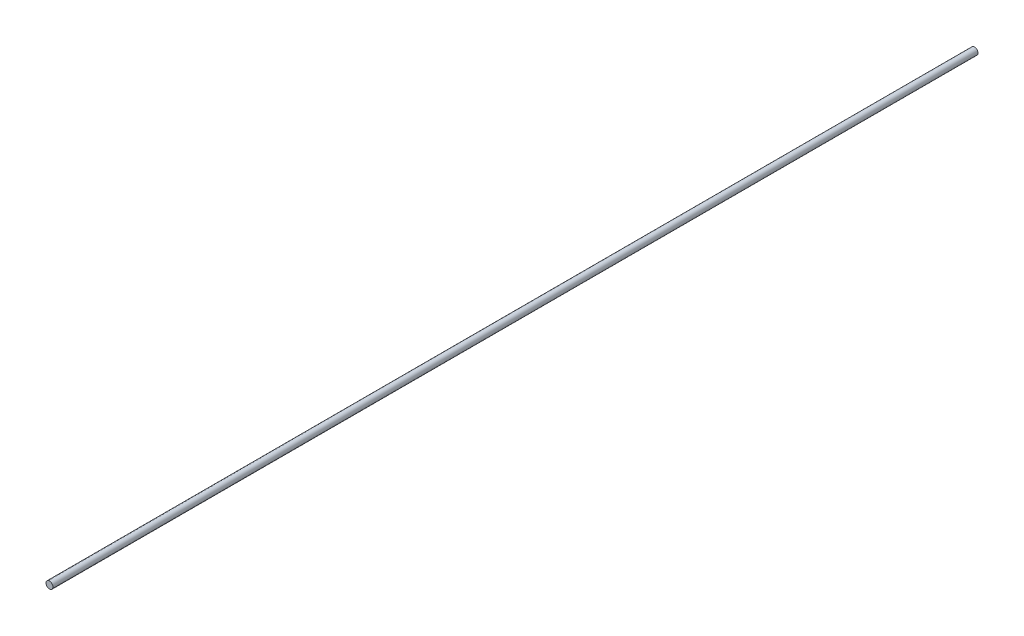
ISO-10303-21;
HEADER;
FILE_DESCRIPTION(('STEP AP214'),'2;1');
FILE_NAME('part.step','',(''),(''),'','','');
FILE_SCHEMA(('AUTOMOTIVE_DESIGN { 1 0 10303 214 1 1 1 1 }'));
ENDSEC;
DATA;
#1=APPLICATION_CONTEXT('core data for automotive mechanical design processes');
#2=APPLICATION_PROTOCOL_DEFINITION('international standard','automotive_design',2000,#1);
#3=PRODUCT_CONTEXT('',#1,'mechanical');
#4=PRODUCT('Part','Part','',(#3));
#5=PRODUCT_RELATED_PRODUCT_CATEGORY('part','',(#4));
#6=PRODUCT_DEFINITION_FORMATION('','',#4);
#7=PRODUCT_DEFINITION_CONTEXT('part definition',#1,'design');
#8=PRODUCT_DEFINITION('design','',#6,#7);
#9=PRODUCT_DEFINITION_SHAPE('','',#8);
#10=(LENGTH_UNIT() NAMED_UNIT(*) SI_UNIT(.MILLI.,.METRE.));
#11=(NAMED_UNIT(*) PLANE_ANGLE_UNIT() SI_UNIT($,.RADIAN.));
#12=(NAMED_UNIT(*) SI_UNIT($,.STERADIAN.) SOLID_ANGLE_UNIT());
#13=UNCERTAINTY_MEASURE_WITH_UNIT(LENGTH_MEASURE(1.E-05),#10,'distance_accuracy_value','');
#14=(GEOMETRIC_REPRESENTATION_CONTEXT(3) GLOBAL_UNCERTAINTY_ASSIGNED_CONTEXT((#13)) GLOBAL_UNIT_ASSIGNED_CONTEXT((#10,
#11,#12)) REPRESENTATION_CONTEXT('',''));
#15=CARTESIAN_POINT('',(0.,0.,0.));
#16=DIRECTION('',(0.,0.,1.));
#17=DIRECTION('',(1.,0.,0.));
#18=AXIS2_PLACEMENT_3D('',#15,#16,#17);
#19=CARTESIAN_POINT('',(0.,0.,200.));
#20=DIRECTION('',(0.,0.,-1.));
#21=DIRECTION('',(-1.,0.,0.));
#22=AXIS2_PLACEMENT_3D('',#19,#20,#21);
#23=CYLINDRICAL_SURFACE('',#22,0.75);
#24=CARTESIAN_POINT('',(0.,0.,200.));
#25=DIRECTION('',(0.,0.,1.));
#26=DIRECTION('',(1.,0.,0.));
#27=AXIS2_PLACEMENT_3D('',#24,#25,#26);
#28=CIRCLE('',#27,0.75);
#29=CARTESIAN_POINT('',(0.75,0.,200.));
#30=VERTEX_POINT('',#29);
#31=EDGE_CURVE('E10',#30,#30,#28,.T.);
#32=ORIENTED_EDGE('',*,*,#31,.F.);
#33=EDGE_LOOP('',(#32));
#34=FACE_BOUND('',#33,.T.);
#35=CARTESIAN_POINT('',(0.,0.,0.));
#36=DIRECTION('',(0.,0.,1.));
#37=DIRECTION('',(1.,0.,0.));
#38=AXIS2_PLACEMENT_3D('',#35,#36,#37);
#39=CIRCLE('',#38,0.75);
#40=CARTESIAN_POINT('',(0.75,0.,0.));
#41=VERTEX_POINT('',#40);
#42=EDGE_CURVE('E37',#41,#41,#39,.T.);
#43=ORIENTED_EDGE('',*,*,#42,.T.);
#44=EDGE_LOOP('',(#43));
#45=FACE_BOUND('',#44,.T.);
#46=ADVANCED_FACE('F34',(#34,#45),#23,.T.);
#47=CARTESIAN_POINT('',(0.,0.,200.));
#48=DIRECTION('',(0.,0.,1.));
#49=DIRECTION('',(1.,0.,0.));
#50=AXIS2_PLACEMENT_3D('',#47,#48,#49);
#51=PLANE('',#50);
#52=ORIENTED_EDGE('',*,*,#31,.T.);
#53=EDGE_LOOP('',(#52));
#54=FACE_BOUND('',#53,.T.);
#55=ADVANCED_FACE('F49',(#54),#51,.T.);
#56=CARTESIAN_POINT('',(0.,0.,0.));
#57=DIRECTION('',(0.,0.,1.));
#58=DIRECTION('',(1.,0.,0.));
#59=AXIS2_PLACEMENT_3D('',#56,#57,#58);
#60=PLANE('',#59);
#61=ORIENTED_EDGE('',*,*,#42,.F.);
#62=EDGE_LOOP('',(#61));
#63=FACE_BOUND('',#62,.T.);
#64=ADVANCED_FACE('F47',(#63),#60,.F.);
#65=CLOSED_SHELL('',(#46,#55,#64));
#66=MANIFOLD_SOLID_BREP('B2',#65);
#67=ADVANCED_BREP_SHAPE_REPRESENTATION('',(#18,#66),#14);
#68=SHAPE_DEFINITION_REPRESENTATION(#9,#67);
ENDSEC;
END-ISO-10303-21;
